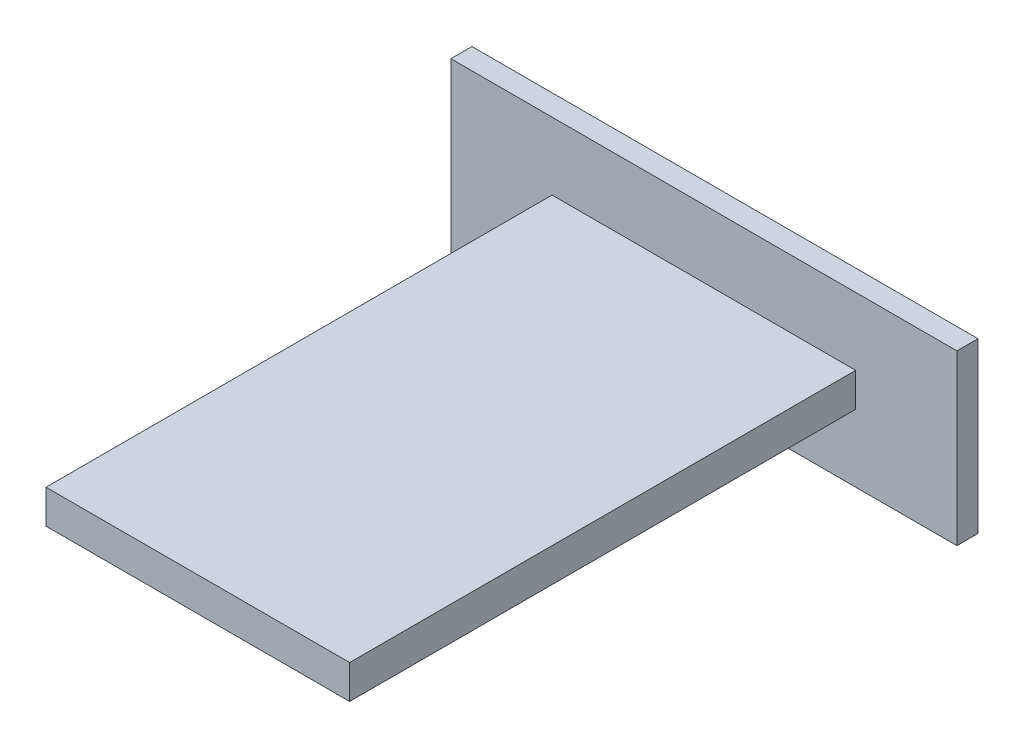
ISO-10303-21;
HEADER;
FILE_DESCRIPTION(('STEP AP214'),'2;1');
FILE_NAME('part.step','',(''),(''),'','','');
FILE_SCHEMA(('AUTOMOTIVE_DESIGN { 1 0 10303 214 1 1 1 1 }'));
ENDSEC;
DATA;
#1=APPLICATION_CONTEXT('core data for automotive mechanical design processes');
#2=APPLICATION_PROTOCOL_DEFINITION('international standard','automotive_design',2000,#1);
#3=PRODUCT_CONTEXT('',#1,'mechanical');
#4=PRODUCT('Part','Part','',(#3));
#5=PRODUCT_RELATED_PRODUCT_CATEGORY('part','',(#4));
#6=PRODUCT_DEFINITION_FORMATION('','',#4);
#7=PRODUCT_DEFINITION_CONTEXT('part definition',#1,'design');
#8=PRODUCT_DEFINITION('design','',#6,#7);
#9=PRODUCT_DEFINITION_SHAPE('','',#8);
#10=(LENGTH_UNIT() NAMED_UNIT(*) SI_UNIT(.MILLI.,.METRE.));
#11=(NAMED_UNIT(*) PLANE_ANGLE_UNIT() SI_UNIT($,.RADIAN.));
#12=(NAMED_UNIT(*) SI_UNIT($,.STERADIAN.) SOLID_ANGLE_UNIT());
#13=UNCERTAINTY_MEASURE_WITH_UNIT(LENGTH_MEASURE(1.E-05),#10,'distance_accuracy_value','');
#14=(GEOMETRIC_REPRESENTATION_CONTEXT(3) GLOBAL_UNCERTAINTY_ASSIGNED_CONTEXT((#13)) GLOBAL_UNIT_ASSIGNED_CONTEXT((#10,
#11,#12)) REPRESENTATION_CONTEXT('',''));
#15=CARTESIAN_POINT('',(0.,0.,0.));
#16=DIRECTION('',(0.,0.,1.));
#17=DIRECTION('',(1.,0.,0.));
#18=AXIS2_PLACEMENT_3D('',#15,#16,#17);
#19=CARTESIAN_POINT('',(9.,2.,15.));
#20=DIRECTION('',(-1.,0.,0.));
#21=DIRECTION('',(0.,0.,1.));
#22=AXIS2_PLACEMENT_3D('',#19,#20,#21);
#23=PLANE('',#22);
#24=DIRECTION('',(0.,0.,-1.));
#25=VECTOR('',#24,1.);
#26=CARTESIAN_POINT('',(9.,0.,15.));
#27=LINE('',#26,#25);
#28=CARTESIAN_POINT('',(9.,0.,15.));
#29=VERTEX_POINT('',#28);
#30=CARTESIAN_POINT('',(9.,0.,-15.));
#31=VERTEX_POINT('',#30);
#32=EDGE_CURVE('E146',#29,#31,#27,.T.);
#33=ORIENTED_EDGE('',*,*,#32,.T.);
#34=DIRECTION('',(0.,-1.,0.));
#35=VECTOR('',#34,1.);
#36=CARTESIAN_POINT('',(9.,2.,-15.));
#37=LINE('',#36,#35);
#38=CARTESIAN_POINT('',(9.,2.,-15.));
#39=VERTEX_POINT('',#38);
#40=EDGE_CURVE('E11',#39,#31,#37,.T.);
#41=ORIENTED_EDGE('',*,*,#40,.F.);
#42=DIRECTION('',(0.,0.,-1.));
#43=VECTOR('',#42,1.);
#44=CARTESIAN_POINT('',(9.,2.,15.));
#45=LINE('',#44,#43);
#46=CARTESIAN_POINT('',(9.,2.,15.));
#47=VERTEX_POINT('',#46);
#48=EDGE_CURVE('E87',#47,#39,#45,.T.);
#49=ORIENTED_EDGE('',*,*,#48,.F.);
#50=DIRECTION('',(0.,-1.,0.));
#51=VECTOR('',#50,1.);
#52=CARTESIAN_POINT('',(9.,2.,15.));
#53=LINE('',#52,#51);
#54=EDGE_CURVE('E165',#47,#29,#53,.T.);
#55=ORIENTED_EDGE('',*,*,#54,.T.);
#56=EDGE_LOOP('',(#33,#41,#49,#55));
#57=FACE_BOUND('',#56,.T.);
#58=ADVANCED_FACE('F45',(#57),#23,.F.);
#59=CARTESIAN_POINT('',(-9.,2.,15.));
#60=DIRECTION('',(1.,0.,0.));
#61=DIRECTION('',(0.,0.,-1.));
#62=AXIS2_PLACEMENT_3D('',#59,#60,#61);
#63=PLANE('',#62);
#64=DIRECTION('',(0.,0.,1.));
#65=VECTOR('',#64,1.);
#66=CARTESIAN_POINT('',(-9.,0.,15.));
#67=LINE('',#66,#65);
#68=CARTESIAN_POINT('',(-9.,0.,-15.));
#69=VERTEX_POINT('',#68);
#70=CARTESIAN_POINT('',(-9.,0.,15.));
#71=VERTEX_POINT('',#70);
#72=EDGE_CURVE('E76',#69,#71,#67,.T.);
#73=ORIENTED_EDGE('',*,*,#72,.T.);
#74=DIRECTION('',(0.,-1.,0.));
#75=VECTOR('',#74,1.);
#76=CARTESIAN_POINT('',(-9.,2.,15.));
#77=LINE('',#76,#75);
#78=CARTESIAN_POINT('',(-9.,2.,15.));
#79=VERTEX_POINT('',#78);
#80=EDGE_CURVE('E176',#79,#71,#77,.T.);
#81=ORIENTED_EDGE('',*,*,#80,.F.);
#82=DIRECTION('',(0.,0.,1.));
#83=VECTOR('',#82,1.);
#84=CARTESIAN_POINT('',(-9.,2.,15.));
#85=LINE('',#84,#83);
#86=CARTESIAN_POINT('',(-9.,2.,-15.));
#87=VERTEX_POINT('',#86);
#88=EDGE_CURVE('E161',#87,#79,#85,.T.);
#89=ORIENTED_EDGE('',*,*,#88,.F.);
#90=DIRECTION('',(0.,-1.,0.));
#91=VECTOR('',#90,1.);
#92=CARTESIAN_POINT('',(-9.,2.,-15.));
#93=LINE('',#92,#91);
#94=EDGE_CURVE('E54',#87,#69,#93,.T.);
#95=ORIENTED_EDGE('',*,*,#94,.T.);
#96=EDGE_LOOP('',(#73,#81,#89,#95));
#97=FACE_BOUND('',#96,.T.);
#98=ADVANCED_FACE('F181',(#97),#63,.F.);
#99=CARTESIAN_POINT('',(-9.,2.,15.));
#100=DIRECTION('',(0.,0.,-1.));
#101=DIRECTION('',(-1.,0.,0.));
#102=AXIS2_PLACEMENT_3D('',#99,#100,#101);
#103=PLANE('',#102);
#104=DIRECTION('',(1.,0.,0.));
#105=VECTOR('',#104,1.);
#106=CARTESIAN_POINT('',(-9.,0.,15.));
#107=LINE('',#106,#105);
#108=EDGE_CURVE('E82',#71,#29,#107,.T.);
#109=ORIENTED_EDGE('',*,*,#108,.T.);
#110=ORIENTED_EDGE('',*,*,#54,.F.);
#111=DIRECTION('',(1.,0.,0.));
#112=VECTOR('',#111,1.);
#113=CARTESIAN_POINT('',(-9.,2.,15.));
#114=LINE('',#113,#112);
#115=EDGE_CURVE('E62',#79,#47,#114,.T.);
#116=ORIENTED_EDGE('',*,*,#115,.F.);
#117=ORIENTED_EDGE('',*,*,#80,.T.);
#118=EDGE_LOOP('',(#109,#110,#116,#117));
#119=FACE_BOUND('',#118,.T.);
#120=ADVANCED_FACE('F191',(#119),#103,.F.);
#121=CARTESIAN_POINT('',(0.,2.,0.));
#122=DIRECTION('',(0.,-1.,0.));
#123=DIRECTION('',(0.,0.,-1.));
#124=AXIS2_PLACEMENT_3D('',#121,#122,#123);
#125=PLANE('',#124);
#126=ORIENTED_EDGE('',*,*,#48,.T.);
#127=DIRECTION('',(-1.,0.,0.));
#128=VECTOR('',#127,1.);
#129=CARTESIAN_POINT('',(-9.,2.,-15.));
#130=LINE('',#129,#128);
#131=EDGE_CURVE('E158',#39,#87,#130,.T.);
#132=ORIENTED_EDGE('',*,*,#131,.T.);
#133=ORIENTED_EDGE('',*,*,#88,.T.);
#134=ORIENTED_EDGE('',*,*,#115,.T.);
#135=EDGE_LOOP('',(#126,#132,#133,#134));
#136=FACE_BOUND('',#135,.T.);
#137=ADVANCED_FACE('F193',(#136),#125,.F.);
#138=CARTESIAN_POINT('',(0.,0.,0.));
#139=DIRECTION('',(0.,-1.,0.));
#140=DIRECTION('',(0.,0.,-1.));
#141=AXIS2_PLACEMENT_3D('',#138,#139,#140);
#142=PLANE('',#141);
#143=ORIENTED_EDGE('',*,*,#32,.F.);
#144=ORIENTED_EDGE('',*,*,#108,.F.);
#145=ORIENTED_EDGE('',*,*,#72,.F.);
#146=DIRECTION('',(-1.,0.,0.));
#147=VECTOR('',#146,1.);
#148=CARTESIAN_POINT('',(-9.,0.,-15.));
#149=LINE('',#148,#147);
#150=EDGE_CURVE('E150',#31,#69,#149,.T.);
#151=ORIENTED_EDGE('',*,*,#150,.F.);
#152=EDGE_LOOP('',(#143,#144,#145,#151));
#153=FACE_BOUND('',#152,.T.);
#154=ADVANCED_FACE('F187',(#153),#142,.T.);
#155=CARTESIAN_POINT('',(-15.,-4.,-16.25));
#156=DIRECTION('',(1.,0.,0.));
#157=DIRECTION('',(0.,0.,-1.));
#158=AXIS2_PLACEMENT_3D('',#155,#156,#157);
#159=PLANE('',#158);
#160=DIRECTION('',(0.,1.,0.));
#161=VECTOR('',#160,1.);
#162=CARTESIAN_POINT('',(-15.,-4.,-15.));
#163=LINE('',#162,#161);
#164=CARTESIAN_POINT('',(-15.,-4.,-15.));
#165=VERTEX_POINT('',#164);
#166=CARTESIAN_POINT('',(-15.,6.,-15.));
#167=VERTEX_POINT('',#166);
#168=EDGE_CURVE('E144',#165,#167,#163,.T.);
#169=ORIENTED_EDGE('',*,*,#168,.T.);
#170=DIRECTION('',(0.,0.,1.));
#171=VECTOR('',#170,1.);
#172=CARTESIAN_POINT('',(-15.,6.,-16.25));
#173=LINE('',#172,#171);
#174=CARTESIAN_POINT('',(-15.,6.,-16.25));
#175=VERTEX_POINT('',#174);
#176=EDGE_CURVE('E122',#175,#167,#173,.T.);
#177=ORIENTED_EDGE('',*,*,#176,.F.);
#178=DIRECTION('',(0.,1.,0.));
#179=VECTOR('',#178,1.);
#180=CARTESIAN_POINT('',(-15.,-4.,-16.25));
#181=LINE('',#180,#179);
#182=CARTESIAN_POINT('',(-15.,-4.,-16.25));
#183=VERTEX_POINT('',#182);
#184=EDGE_CURVE('E130',#183,#175,#181,.T.);
#185=ORIENTED_EDGE('',*,*,#184,.F.);
#186=DIRECTION('',(0.,0.,1.));
#187=VECTOR('',#186,1.);
#188=CARTESIAN_POINT('',(-15.,-4.,-16.25));
#189=LINE('',#188,#187);
#190=EDGE_CURVE('E285',#183,#165,#189,.T.);
#191=ORIENTED_EDGE('',*,*,#190,.T.);
#192=EDGE_LOOP('',(#169,#177,#185,#191));
#193=FACE_BOUND('',#192,.T.);
#194=ADVANCED_FACE('F142',(#193),#159,.F.);
#195=CARTESIAN_POINT('',(15.,6.,-16.25));
#196=DIRECTION('',(0.,-1.,0.));
#197=DIRECTION('',(0.,0.,-1.));
#198=AXIS2_PLACEMENT_3D('',#195,#196,#197);
#199=PLANE('',#198);
#200=DIRECTION('',(1.,0.,0.));
#201=VECTOR('',#200,1.);
#202=CARTESIAN_POINT('',(15.,6.,-15.));
#203=LINE('',#202,#201);
#204=CARTESIAN_POINT('',(15.,6.,-15.));
#205=VERTEX_POINT('',#204);
#206=EDGE_CURVE('E293',#167,#205,#203,.T.);
#207=ORIENTED_EDGE('',*,*,#206,.T.);
#208=DIRECTION('',(0.,0.,1.));
#209=VECTOR('',#208,1.);
#210=CARTESIAN_POINT('',(15.,6.,-16.25));
#211=LINE('',#210,#209);
#212=CARTESIAN_POINT('',(15.,6.,-16.25));
#213=VERTEX_POINT('',#212);
#214=EDGE_CURVE('E125',#213,#205,#211,.T.);
#215=ORIENTED_EDGE('',*,*,#214,.F.);
#216=DIRECTION('',(1.,0.,0.));
#217=VECTOR('',#216,1.);
#218=CARTESIAN_POINT('',(15.,6.,-16.25));
#219=LINE('',#218,#217);
#220=EDGE_CURVE('E118',#175,#213,#219,.T.);
#221=ORIENTED_EDGE('',*,*,#220,.F.);
#222=ORIENTED_EDGE('',*,*,#176,.T.);
#223=EDGE_LOOP('',(#207,#215,#221,#222));
#224=FACE_BOUND('',#223,.T.);
#225=ADVANCED_FACE('F120',(#224),#199,.F.);
#226=CARTESIAN_POINT('',(15.,-4.,-16.25));
#227=DIRECTION('',(-1.,0.,0.));
#228=DIRECTION('',(0.,0.,1.));
#229=AXIS2_PLACEMENT_3D('',#226,#227,#228);
#230=PLANE('',#229);
#231=DIRECTION('',(0.,-1.,0.));
#232=VECTOR('',#231,1.);
#233=CARTESIAN_POINT('',(15.,-4.,-15.));
#234=LINE('',#233,#232);
#235=CARTESIAN_POINT('',(15.,-4.,-15.));
#236=VERTEX_POINT('',#235);
#237=EDGE_CURVE('E289',#205,#236,#234,.T.);
#238=ORIENTED_EDGE('',*,*,#237,.T.);
#239=DIRECTION('',(0.,0.,1.));
#240=VECTOR('',#239,1.);
#241=CARTESIAN_POINT('',(15.,-4.,-16.25));
#242=LINE('',#241,#240);
#243=CARTESIAN_POINT('',(15.,-4.,-16.25));
#244=VERTEX_POINT('',#243);
#245=EDGE_CURVE('E152',#244,#236,#242,.T.);
#246=ORIENTED_EDGE('',*,*,#245,.F.);
#247=DIRECTION('',(0.,-1.,0.));
#248=VECTOR('',#247,1.);
#249=CARTESIAN_POINT('',(15.,-4.,-16.25));
#250=LINE('',#249,#248);
#251=EDGE_CURVE('E129',#213,#244,#250,.T.);
#252=ORIENTED_EDGE('',*,*,#251,.F.);
#253=ORIENTED_EDGE('',*,*,#214,.T.);
#254=EDGE_LOOP('',(#238,#246,#252,#253));
#255=FACE_BOUND('',#254,.T.);
#256=ADVANCED_FACE('F234',(#255),#230,.F.);
#257=CARTESIAN_POINT('',(15.,-4.,-16.25));
#258=DIRECTION('',(0.,1.,0.));
#259=DIRECTION('',(0.,0.,1.));
#260=AXIS2_PLACEMENT_3D('',#257,#258,#259);
#261=PLANE('',#260);
#262=DIRECTION('',(-1.,0.,0.));
#263=VECTOR('',#262,1.);
#264=CARTESIAN_POINT('',(15.,-4.,-15.));
#265=LINE('',#264,#263);
#266=EDGE_CURVE('E140',#236,#165,#265,.T.);
#267=ORIENTED_EDGE('',*,*,#266,.T.);
#268=ORIENTED_EDGE('',*,*,#190,.F.);
#269=DIRECTION('',(-1.,0.,0.));
#270=VECTOR('',#269,1.);
#271=CARTESIAN_POINT('',(15.,-4.,-16.25));
#272=LINE('',#271,#270);
#273=EDGE_CURVE('E135',#244,#183,#272,.T.);
#274=ORIENTED_EDGE('',*,*,#273,.F.);
#275=ORIENTED_EDGE('',*,*,#245,.T.);
#276=EDGE_LOOP('',(#267,#268,#274,#275));
#277=FACE_BOUND('',#276,.T.);
#278=ADVANCED_FACE('F242',(#277),#261,.F.);
#279=CARTESIAN_POINT('',(0.,0.,-16.25));
#280=DIRECTION('',(0.,0.,1.));
#281=DIRECTION('',(1.,0.,0.));
#282=AXIS2_PLACEMENT_3D('',#279,#280,#281);
#283=PLANE('',#282);
#284=ORIENTED_EDGE('',*,*,#184,.T.);
#285=ORIENTED_EDGE('',*,*,#220,.T.);
#286=ORIENTED_EDGE('',*,*,#251,.T.);
#287=ORIENTED_EDGE('',*,*,#273,.T.);
#288=EDGE_LOOP('',(#284,#285,#286,#287));
#289=FACE_BOUND('',#288,.T.);
#290=ADVANCED_FACE('F133',(#289),#283,.F.);
#291=CARTESIAN_POINT('',(0.,0.,-15.));
#292=DIRECTION('',(0.,0.,1.));
#293=DIRECTION('',(1.,0.,0.));
#294=AXIS2_PLACEMENT_3D('',#291,#292,#293);
#295=PLANE('',#294);
#296=ORIENTED_EDGE('',*,*,#40,.T.);
#297=ORIENTED_EDGE('',*,*,#150,.T.);
#298=ORIENTED_EDGE('',*,*,#94,.F.);
#299=ORIENTED_EDGE('',*,*,#131,.F.);
#300=EDGE_LOOP('',(#296,#297,#298,#299));
#301=FACE_BOUND('',#300,.T.);
#302=ORIENTED_EDGE('',*,*,#168,.F.);
#303=ORIENTED_EDGE('',*,*,#266,.F.);
#304=ORIENTED_EDGE('',*,*,#237,.F.);
#305=ORIENTED_EDGE('',*,*,#206,.F.);
#306=EDGE_LOOP('',(#302,#303,#304,#305));
#307=FACE_BOUND('',#306,.T.);
#308=ADVANCED_FACE('F188',(#301,#307),#295,.T.);
#309=CLOSED_SHELL('',(#58,#98,#120,#137,#154,#194,#225,#256,#278,#290,#308));
#310=MANIFOLD_SOLID_BREP('B2',#309);
#311=ADVANCED_BREP_SHAPE_REPRESENTATION('',(#18,#310),#14);
#312=SHAPE_DEFINITION_REPRESENTATION(#9,#311);
ENDSEC;
END-ISO-10303-21;
